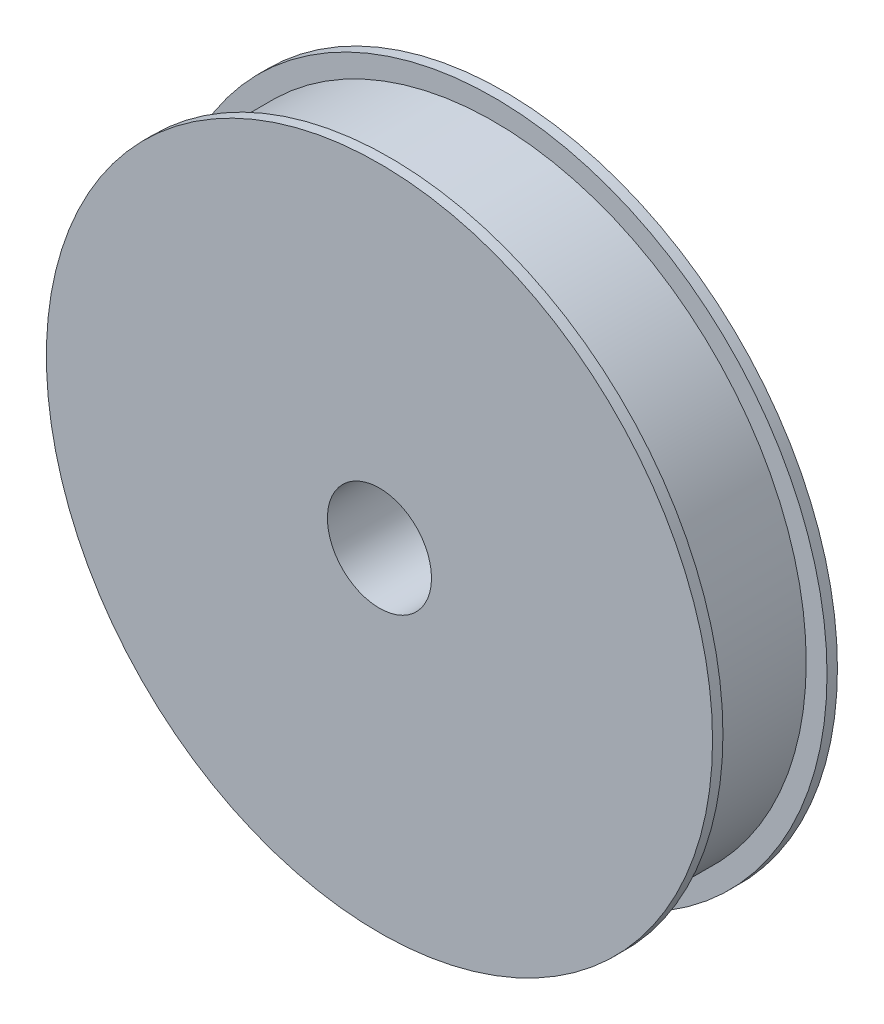
ISO-10303-21;
HEADER;
FILE_DESCRIPTION(('STEP AP214'),'2;1');
FILE_NAME('part.step','',(''),(''),'','','');
FILE_SCHEMA(('AUTOMOTIVE_DESIGN { 1 0 10303 214 1 1 1 1 }'));
ENDSEC;
DATA;
#1=APPLICATION_CONTEXT('core data for automotive mechanical design processes');
#2=APPLICATION_PROTOCOL_DEFINITION('international standard','automotive_design',2000,#1);
#3=PRODUCT_CONTEXT('',#1,'mechanical');
#4=PRODUCT('Part','Part','',(#3));
#5=PRODUCT_RELATED_PRODUCT_CATEGORY('part','',(#4));
#6=PRODUCT_DEFINITION_FORMATION('','',#4);
#7=PRODUCT_DEFINITION_CONTEXT('part definition',#1,'design');
#8=PRODUCT_DEFINITION('design','',#6,#7);
#9=PRODUCT_DEFINITION_SHAPE('','',#8);
#10=(LENGTH_UNIT() NAMED_UNIT(*) SI_UNIT(.MILLI.,.METRE.));
#11=(NAMED_UNIT(*) PLANE_ANGLE_UNIT() SI_UNIT($,.RADIAN.));
#12=(NAMED_UNIT(*) SI_UNIT($,.STERADIAN.) SOLID_ANGLE_UNIT());
#13=UNCERTAINTY_MEASURE_WITH_UNIT(LENGTH_MEASURE(1.E-05),#10,'distance_accuracy_value','');
#14=(GEOMETRIC_REPRESENTATION_CONTEXT(3) GLOBAL_UNCERTAINTY_ASSIGNED_CONTEXT((#13)) GLOBAL_UNIT_ASSIGNED_CONTEXT((#10,
#11,#12)) REPRESENTATION_CONTEXT('',''));
#15=CARTESIAN_POINT('',(0.,0.,0.));
#16=DIRECTION('',(0.,0.,1.));
#17=DIRECTION('',(1.,0.,0.));
#18=AXIS2_PLACEMENT_3D('',#15,#16,#17);
#19=CARTESIAN_POINT('',(0.,32.,6.));
#20=DIRECTION('',(0.,0.,-1.));
#21=DIRECTION('',(-1.,0.,0.));
#22=AXIS2_PLACEMENT_3D('',#19,#20,#21);
#23=PLANE('',#22);
#24=CARTESIAN_POINT('',(0.,0.,6.));
#25=DIRECTION('',(0.,0.,1.));
#26=DIRECTION('',(1.,0.,0.));
#27=AXIS2_PLACEMENT_3D('',#24,#25,#26);
#28=CIRCLE('',#27,5.);
#29=CARTESIAN_POINT('',(5.,0.,6.));
#30=VERTEX_POINT('',#29);
#31=EDGE_CURVE('E60',#30,#30,#28,.T.);
#32=ORIENTED_EDGE('',*,*,#31,.F.);
#33=EDGE_LOOP('',(#32));
#34=FACE_BOUND('',#33,.T.);
#35=CARTESIAN_POINT('',(0.,0.,6.));
#36=DIRECTION('',(0.,0.,1.));
#37=DIRECTION('',(1.,0.,0.));
#38=AXIS2_PLACEMENT_3D('',#35,#36,#37);
#39=CIRCLE('',#38,32.);
#40=CARTESIAN_POINT('',(32.,0.,6.));
#41=VERTEX_POINT('',#40);
#42=EDGE_CURVE('E54',#41,#41,#39,.T.);
#43=ORIENTED_EDGE('',*,*,#42,.T.);
#44=EDGE_LOOP('',(#43));
#45=FACE_BOUND('',#44,.T.);
#46=ADVANCED_FACE('F32',(#34,#45),#23,.F.);
#47=CARTESIAN_POINT('',(0.,32.,-6.));
#48=DIRECTION('',(0.,0.,1.));
#49=DIRECTION('',(1.,0.,0.));
#50=AXIS2_PLACEMENT_3D('',#47,#48,#49);
#51=PLANE('',#50);
#52=CARTESIAN_POINT('',(0.,0.,-6.));
#53=DIRECTION('',(0.,0.,1.));
#54=DIRECTION('',(1.,0.,0.));
#55=AXIS2_PLACEMENT_3D('',#52,#53,#54);
#56=CIRCLE('',#55,5.);
#57=CARTESIAN_POINT('',(5.,0.,-6.));
#58=VERTEX_POINT('',#57);
#59=EDGE_CURVE('E57',#58,#58,#56,.T.);
#60=ORIENTED_EDGE('',*,*,#59,.T.);
#61=EDGE_LOOP('',(#60));
#62=FACE_BOUND('',#61,.T.);
#63=CARTESIAN_POINT('',(0.,0.,-6.));
#64=DIRECTION('',(0.,0.,1.));
#65=DIRECTION('',(1.,0.,0.));
#66=AXIS2_PLACEMENT_3D('',#63,#64,#65);
#67=CIRCLE('',#66,32.);
#68=CARTESIAN_POINT('',(32.,0.,-6.));
#69=VERTEX_POINT('',#68);
#70=EDGE_CURVE('E10',#69,#69,#67,.T.);
#71=ORIENTED_EDGE('',*,*,#70,.F.);
#72=EDGE_LOOP('',(#71));
#73=FACE_BOUND('',#72,.T.);
#74=ADVANCED_FACE('F68',(#62,#73),#51,.F.);
#75=CARTESIAN_POINT('',(0.,0.,6.));
#76=DIRECTION('',(0.,0.,1.));
#77=DIRECTION('',(1.,0.,0.));
#78=AXIS2_PLACEMENT_3D('',#75,#76,#77);
#79=CYLINDRICAL_SURFACE('',#78,32.);
#80=CARTESIAN_POINT('',(0.,0.,-5.));
#81=DIRECTION('',(0.,0.,1.));
#82=DIRECTION('',(1.,0.,0.));
#83=AXIS2_PLACEMENT_3D('',#80,#81,#82);
#84=CIRCLE('',#83,32.);
#85=CARTESIAN_POINT('',(32.,0.,-5.));
#86=VERTEX_POINT('',#85);
#87=EDGE_CURVE('E38',#86,#86,#84,.T.);
#88=ORIENTED_EDGE('',*,*,#87,.F.);
#89=EDGE_LOOP('',(#88));
#90=FACE_BOUND('',#89,.T.);
#91=ORIENTED_EDGE('',*,*,#70,.T.);
#92=EDGE_LOOP('',(#91));
#93=FACE_BOUND('',#92,.T.);
#94=ADVANCED_FACE('F91',(#90,#93),#79,.T.);
#95=CARTESIAN_POINT('',(0.,30.,-5.));
#96=DIRECTION('',(0.,0.,-1.));
#97=DIRECTION('',(-1.,0.,0.));
#98=AXIS2_PLACEMENT_3D('',#95,#96,#97);
#99=PLANE('',#98);
#100=CARTESIAN_POINT('',(0.,0.,-5.));
#101=DIRECTION('',(0.,0.,1.));
#102=DIRECTION('',(1.,0.,0.));
#103=AXIS2_PLACEMENT_3D('',#100,#101,#102);
#104=CIRCLE('',#103,30.);
#105=CARTESIAN_POINT('',(30.,0.,-5.));
#106=VERTEX_POINT('',#105);
#107=EDGE_CURVE('E42',#106,#106,#104,.T.);
#108=ORIENTED_EDGE('',*,*,#107,.F.);
#109=EDGE_LOOP('',(#108));
#110=FACE_BOUND('',#109,.T.);
#111=ORIENTED_EDGE('',*,*,#87,.T.);
#112=EDGE_LOOP('',(#111));
#113=FACE_BOUND('',#112,.T.);
#114=ADVANCED_FACE('F86',(#110,#113),#99,.F.);
#115=CARTESIAN_POINT('',(0.,0.,6.));
#116=DIRECTION('',(0.,0.,1.));
#117=DIRECTION('',(1.,0.,0.));
#118=AXIS2_PLACEMENT_3D('',#115,#116,#117);
#119=CYLINDRICAL_SURFACE('',#118,30.);
#120=CARTESIAN_POINT('',(0.,0.,5.));
#121=DIRECTION('',(0.,0.,1.));
#122=DIRECTION('',(1.,0.,0.));
#123=AXIS2_PLACEMENT_3D('',#120,#121,#122);
#124=CIRCLE('',#123,30.);
#125=CARTESIAN_POINT('',(30.,0.,5.));
#126=VERTEX_POINT('',#125);
#127=EDGE_CURVE('E46',#126,#126,#124,.T.);
#128=ORIENTED_EDGE('',*,*,#127,.F.);
#129=EDGE_LOOP('',(#128));
#130=FACE_BOUND('',#129,.T.);
#131=ORIENTED_EDGE('',*,*,#107,.T.);
#132=EDGE_LOOP('',(#131));
#133=FACE_BOUND('',#132,.T.);
#134=ADVANCED_FACE('F80',(#130,#133),#119,.T.);
#135=CARTESIAN_POINT('',(0.,32.,5.));
#136=DIRECTION('',(0.,0.,1.));
#137=DIRECTION('',(1.,0.,0.));
#138=AXIS2_PLACEMENT_3D('',#135,#136,#137);
#139=PLANE('',#138);
#140=CARTESIAN_POINT('',(0.,0.,5.));
#141=DIRECTION('',(0.,0.,1.));
#142=DIRECTION('',(1.,0.,0.));
#143=AXIS2_PLACEMENT_3D('',#140,#141,#142);
#144=CIRCLE('',#143,32.);
#145=CARTESIAN_POINT('',(32.,0.,5.));
#146=VERTEX_POINT('',#145);
#147=EDGE_CURVE('E51',#146,#146,#144,.T.);
#148=ORIENTED_EDGE('',*,*,#147,.F.);
#149=EDGE_LOOP('',(#148));
#150=FACE_BOUND('',#149,.T.);
#151=ORIENTED_EDGE('',*,*,#127,.T.);
#152=EDGE_LOOP('',(#151));
#153=FACE_BOUND('',#152,.T.);
#154=ADVANCED_FACE('F74',(#150,#153),#139,.F.);
#155=CARTESIAN_POINT('',(0.,0.,6.));
#156=DIRECTION('',(0.,0.,1.));
#157=DIRECTION('',(1.,0.,0.));
#158=AXIS2_PLACEMENT_3D('',#155,#156,#157);
#159=CYLINDRICAL_SURFACE('',#158,32.);
#160=ORIENTED_EDGE('',*,*,#42,.F.);
#161=EDGE_LOOP('',(#160));
#162=FACE_BOUND('',#161,.T.);
#163=ORIENTED_EDGE('',*,*,#147,.T.);
#164=EDGE_LOOP('',(#163));
#165=FACE_BOUND('',#164,.T.);
#166=ADVANCED_FACE('F71',(#162,#165),#159,.T.);
#167=CARTESIAN_POINT('',(0.,0.,-6.));
#168=DIRECTION('',(0.,0.,1.));
#169=DIRECTION('',(1.,0.,0.));
#170=AXIS2_PLACEMENT_3D('',#167,#168,#169);
#171=CYLINDRICAL_SURFACE('',#170,5.);
#172=CARTESIAN_POINT('',(5.,0.,-6.));
#173=CARTESIAN_POINT('',(5.,0.,-5.875));
#174=CARTESIAN_POINT('',(5.,0.,-5.75));
#175=CARTESIAN_POINT('',(5.,0.,-5.5));
#176=CARTESIAN_POINT('',(5.,0.,-5.375));
#177=CARTESIAN_POINT('',(5.,0.,-5.125));
#178=CARTESIAN_POINT('',(5.,0.,-5.));
#179=CARTESIAN_POINT('',(5.,0.,-4.75));
#180=CARTESIAN_POINT('',(5.,0.,-4.625));
#181=CARTESIAN_POINT('',(5.,0.,-4.375));
#182=CARTESIAN_POINT('',(5.,0.,-4.25));
#183=CARTESIAN_POINT('',(5.,0.,-4.));
#184=CARTESIAN_POINT('',(5.,0.,-3.875));
#185=CARTESIAN_POINT('',(5.,0.,-3.625));
#186=CARTESIAN_POINT('',(5.,0.,-3.5));
#187=CARTESIAN_POINT('',(5.,0.,-3.25));
#188=CARTESIAN_POINT('',(5.,0.,-3.125));
#189=CARTESIAN_POINT('',(5.,0.,-2.875));
#190=CARTESIAN_POINT('',(5.,0.,-2.75));
#191=CARTESIAN_POINT('',(5.,0.,-2.5));
#192=CARTESIAN_POINT('',(5.,0.,-2.375));
#193=CARTESIAN_POINT('',(5.,0.,-2.125));
#194=CARTESIAN_POINT('',(5.,0.,-2.));
#195=CARTESIAN_POINT('',(5.,0.,-1.75));
#196=CARTESIAN_POINT('',(5.,0.,-1.625));
#197=CARTESIAN_POINT('',(5.,0.,-1.375));
#198=CARTESIAN_POINT('',(5.,0.,-1.25));
#199=CARTESIAN_POINT('',(5.,0.,-1.));
#200=CARTESIAN_POINT('',(5.,0.,-0.875000000000001));
#201=CARTESIAN_POINT('',(5.,0.,-0.625000000000001));
#202=CARTESIAN_POINT('',(5.,0.,-0.500000000000001));
#203=CARTESIAN_POINT('',(5.,0.,-0.250000000000001));
#204=CARTESIAN_POINT('',(5.,0.,-0.125000000000001));
#205=CARTESIAN_POINT('',(5.,0.,0.124999999999999));
#206=CARTESIAN_POINT('',(5.,0.,0.249999999999999));
#207=CARTESIAN_POINT('',(5.,0.,0.5));
#208=CARTESIAN_POINT('',(5.,0.,0.625));
#209=CARTESIAN_POINT('',(5.,0.,0.875));
#210=CARTESIAN_POINT('',(5.,0.,0.999999999999999));
#211=CARTESIAN_POINT('',(5.,0.,1.25));
#212=CARTESIAN_POINT('',(5.,0.,1.375));
#213=CARTESIAN_POINT('',(5.,0.,1.625));
#214=CARTESIAN_POINT('',(5.,0.,1.75));
#215=CARTESIAN_POINT('',(5.,0.,2.));
#216=CARTESIAN_POINT('',(5.,0.,2.125));
#217=CARTESIAN_POINT('',(5.,0.,2.375));
#218=CARTESIAN_POINT('',(5.,0.,2.5));
#219=CARTESIAN_POINT('',(5.,0.,2.75));
#220=CARTESIAN_POINT('',(5.,0.,2.875));
#221=CARTESIAN_POINT('',(5.,0.,3.125));
#222=CARTESIAN_POINT('',(5.,0.,3.25));
#223=CARTESIAN_POINT('',(5.,0.,3.5));
#224=CARTESIAN_POINT('',(5.,0.,3.625));
#225=CARTESIAN_POINT('',(5.,0.,3.875));
#226=CARTESIAN_POINT('',(5.,0.,4.));
#227=CARTESIAN_POINT('',(5.,0.,4.25));
#228=CARTESIAN_POINT('',(5.,0.,4.375));
#229=CARTESIAN_POINT('',(5.,0.,4.625));
#230=CARTESIAN_POINT('',(5.,0.,4.75));
#231=CARTESIAN_POINT('',(5.,0.,5.));
#232=CARTESIAN_POINT('',(5.,0.,5.125));
#233=CARTESIAN_POINT('',(5.,0.,5.375));
#234=CARTESIAN_POINT('',(5.,0.,5.5));
#235=CARTESIAN_POINT('',(5.,0.,5.75));
#236=CARTESIAN_POINT('',(5.,0.,5.875));
#237=CARTESIAN_POINT('',(5.,0.,6.));
#238=B_SPLINE_CURVE_WITH_KNOTS('',3,(#172,#173,#174,#175,#176,#177,#178,#179,#180,#181,#182,
#183,#184,#185,#186,#187,#188,#189,#190,#191,#192,#193,#194,#195,#196,#197,#198,#199,#200,#201,
#202,#203,#204,#205,#206,#207,#208,#209,#210,#211,#212,#213,#214,#215,#216,#217,#218,#219,#220,
#221,#222,#223,#224,#225,#226,#227,#228,#229,#230,#231,#232,#233,#234,#235,#236,#237),
.UNSPECIFIED.,.F.,.F.,(4,2,2,2,2,2,2,2,2,2,2,2,2,2,2,2,2,2,2,2,2,2,2,2,2,2,2,2,2,2,2,2,4),(0.,
0.375,0.750000000000001,1.125,1.5,1.875,2.25,2.625,3.,3.375,3.75,4.125,4.5,4.875,5.25,5.625,6.,
6.375,6.75,7.125,7.5,7.875,8.25,8.625,9.,9.375,9.75,10.125,10.5,10.875,11.25,11.625,12.),.UNSPECIFIED.);
#239=EDGE_CURVE('BSEAM64',#58,#30,#238,.T.);
#240=ORIENTED_EDGE('',*,*,#59,.F.);
#241=ORIENTED_EDGE('',*,*,#31,.T.);
#242=ORIENTED_EDGE('',*,*,#239,.T.);
#243=ORIENTED_EDGE('',*,*,#239,.F.);
#244=EDGE_LOOP('',(#240,#242,#241,#243));
#245=FACE_BOUND('',#244,.T.);
#246=ADVANCED_FACE('F64',(#245),#171,.F.);
#247=CLOSED_SHELL('',(#46,#74,#94,#114,#134,#154,#166,#246));
#248=MANIFOLD_SOLID_BREP('B2',#247);
#249=ADVANCED_BREP_SHAPE_REPRESENTATION('',(#18,#248),#14);
#250=SHAPE_DEFINITION_REPRESENTATION(#9,#249);
ENDSEC;
END-ISO-10303-21;
